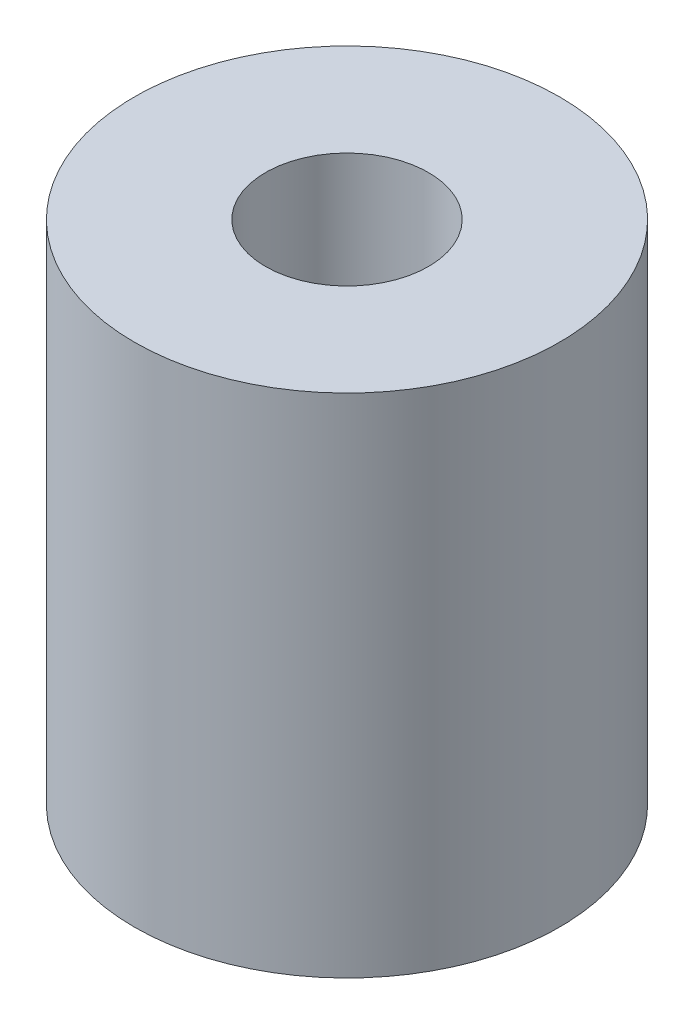
ISO-10303-21;
HEADER;
FILE_DESCRIPTION(('STEP AP214'),'2;1');
FILE_NAME('part.step','',(''),(''),'','','');
FILE_SCHEMA(('AUTOMOTIVE_DESIGN { 1 0 10303 214 1 1 1 1 }'));
ENDSEC;
DATA;
#1=APPLICATION_CONTEXT('core data for automotive mechanical design processes');
#2=APPLICATION_PROTOCOL_DEFINITION('international standard','automotive_design',2000,#1);
#3=PRODUCT_CONTEXT('',#1,'mechanical');
#4=PRODUCT('Part','Part','',(#3));
#5=PRODUCT_RELATED_PRODUCT_CATEGORY('part','',(#4));
#6=PRODUCT_DEFINITION_FORMATION('','',#4);
#7=PRODUCT_DEFINITION_CONTEXT('part definition',#1,'design');
#8=PRODUCT_DEFINITION('design','',#6,#7);
#9=PRODUCT_DEFINITION_SHAPE('','',#8);
#10=(LENGTH_UNIT() NAMED_UNIT(*) SI_UNIT(.MILLI.,.METRE.));
#11=(NAMED_UNIT(*) PLANE_ANGLE_UNIT() SI_UNIT($,.RADIAN.));
#12=(NAMED_UNIT(*) SI_UNIT($,.STERADIAN.) SOLID_ANGLE_UNIT());
#13=UNCERTAINTY_MEASURE_WITH_UNIT(LENGTH_MEASURE(1.E-05),#10,'distance_accuracy_value','');
#14=(GEOMETRIC_REPRESENTATION_CONTEXT(3) GLOBAL_UNCERTAINTY_ASSIGNED_CONTEXT((#13)) GLOBAL_UNIT_ASSIGNED_CONTEXT((#10,
#11,#12)) REPRESENTATION_CONTEXT('',''));
#15=CARTESIAN_POINT('',(0.,0.,0.));
#16=DIRECTION('',(0.,0.,1.));
#17=DIRECTION('',(1.,0.,0.));
#18=AXIS2_PLACEMENT_3D('',#15,#16,#17);
#19=CARTESIAN_POINT('',(0.,14.3,0.));
#20=DIRECTION('',(0.,1.,0.));
#21=DIRECTION('',(0.,0.,1.));
#22=AXIS2_PLACEMENT_3D('',#19,#20,#21);
#23=PLANE('',#22);
#24=CARTESIAN_POINT('',(0.,14.3,0.));
#25=DIRECTION('',(0.,1.,0.));
#26=DIRECTION('',(0.,0.,1.));
#27=AXIS2_PLACEMENT_3D('',#24,#25,#26);
#28=CIRCLE('',#27,6.);
#29=CARTESIAN_POINT('',(0.,14.3,6.));
#30=VERTEX_POINT('',#29);
#31=EDGE_CURVE('E10',#30,#30,#28,.T.);
#32=ORIENTED_EDGE('',*,*,#31,.T.);
#33=EDGE_LOOP('',(#32));
#34=FACE_BOUND('',#33,.T.);
#35=CARTESIAN_POINT('',(0.,14.3,0.));
#36=DIRECTION('',(0.,1.,0.));
#37=DIRECTION('',(0.,0.,1.));
#38=AXIS2_PLACEMENT_3D('',#35,#36,#37);
#39=CIRCLE('',#38,2.3);
#40=CARTESIAN_POINT('',(0.,14.3,2.3));
#41=VERTEX_POINT('',#40);
#42=EDGE_CURVE('E42',#41,#41,#39,.T.);
#43=ORIENTED_EDGE('',*,*,#42,.F.);
#44=EDGE_LOOP('',(#43));
#45=FACE_BOUND('',#44,.T.);
#46=ADVANCED_FACE('F31',(#34,#45),#23,.T.);
#47=CARTESIAN_POINT('',(0.,0.,0.));
#48=DIRECTION('',(0.,1.,0.));
#49=DIRECTION('',(0.,0.,1.));
#50=AXIS2_PLACEMENT_3D('',#47,#48,#49);
#51=PLANE('',#50);
#52=CARTESIAN_POINT('',(0.,0.,0.));
#53=DIRECTION('',(0.,1.,0.));
#54=DIRECTION('',(0.,0.,1.));
#55=AXIS2_PLACEMENT_3D('',#52,#53,#54);
#56=CIRCLE('',#55,6.);
#57=CARTESIAN_POINT('',(0.,0.,6.));
#58=VERTEX_POINT('',#57);
#59=EDGE_CURVE('E35',#58,#58,#56,.T.);
#60=ORIENTED_EDGE('',*,*,#59,.F.);
#61=EDGE_LOOP('',(#60));
#62=FACE_BOUND('',#61,.T.);
#63=CARTESIAN_POINT('',(0.,0.,0.));
#64=DIRECTION('',(0.,1.,0.));
#65=DIRECTION('',(0.,0.,1.));
#66=AXIS2_PLACEMENT_3D('',#63,#64,#65);
#67=CIRCLE('',#66,2.3);
#68=CARTESIAN_POINT('',(0.,0.,2.3));
#69=VERTEX_POINT('',#68);
#70=EDGE_CURVE('E44',#69,#69,#67,.T.);
#71=ORIENTED_EDGE('',*,*,#70,.T.);
#72=EDGE_LOOP('',(#71));
#73=FACE_BOUND('',#72,.T.);
#74=ADVANCED_FACE('F54',(#62,#73),#51,.F.);
#75=CARTESIAN_POINT('',(0.,14.3,0.));
#76=DIRECTION('',(0.,-1.,0.));
#77=DIRECTION('',(0.,0.,-1.));
#78=AXIS2_PLACEMENT_3D('',#75,#76,#77);
#79=CYLINDRICAL_SURFACE('',#78,6.);
#80=ORIENTED_EDGE('',*,*,#31,.F.);
#81=EDGE_LOOP('',(#80));
#82=FACE_BOUND('',#81,.T.);
#83=ORIENTED_EDGE('',*,*,#59,.T.);
#84=EDGE_LOOP('',(#83));
#85=FACE_BOUND('',#84,.T.);
#86=ADVANCED_FACE('F33',(#82,#85),#79,.T.);
#87=CARTESIAN_POINT('',(0.,14.3,0.));
#88=DIRECTION('',(0.,-1.,0.));
#89=DIRECTION('',(0.,0.,-1.));
#90=AXIS2_PLACEMENT_3D('',#87,#88,#89);
#91=CYLINDRICAL_SURFACE('',#90,2.3);
#92=ORIENTED_EDGE('',*,*,#42,.T.);
#93=EDGE_LOOP('',(#92));
#94=FACE_BOUND('',#93,.T.);
#95=ORIENTED_EDGE('',*,*,#70,.F.);
#96=EDGE_LOOP('',(#95));
#97=FACE_BOUND('',#96,.T.);
#98=ADVANCED_FACE('F50',(#94,#97),#91,.F.);
#99=CLOSED_SHELL('',(#46,#74,#86,#98));
#100=MANIFOLD_SOLID_BREP('B2',#99);
#101=ADVANCED_BREP_SHAPE_REPRESENTATION('',(#18,#100),#14);
#102=SHAPE_DEFINITION_REPRESENTATION(#9,#101);
ENDSEC;
END-ISO-10303-21;
